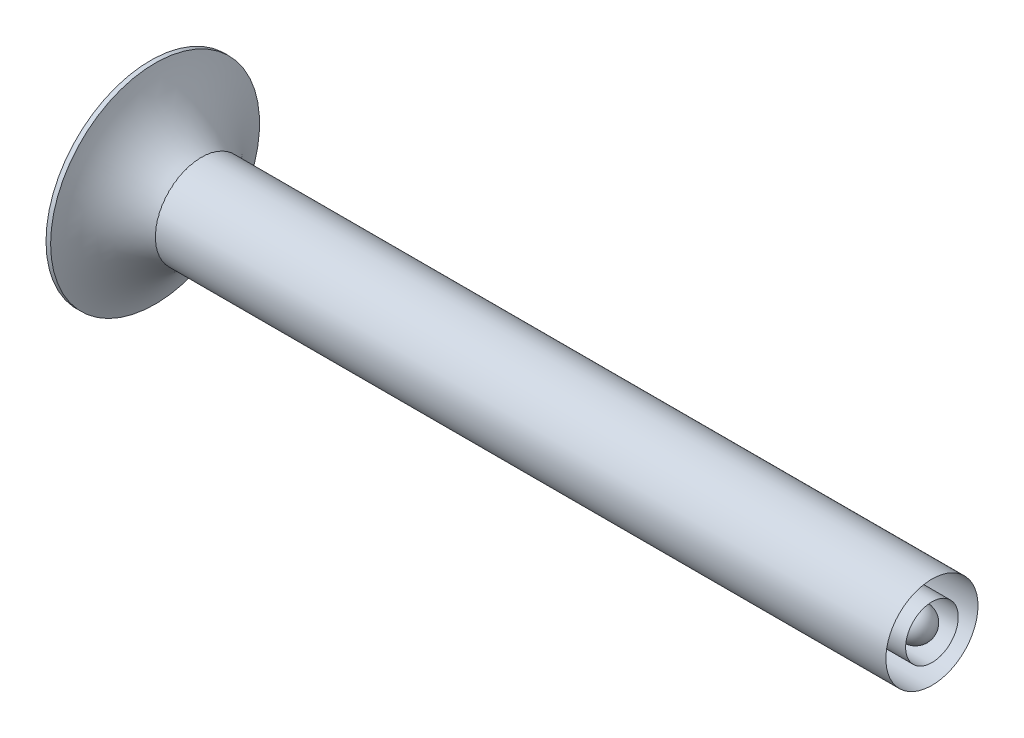
ISO-10303-21;
HEADER;
FILE_DESCRIPTION(('STEP AP214'),'2;1');
FILE_NAME('part.step','',(''),(''),'','','');
FILE_SCHEMA(('AUTOMOTIVE_DESIGN { 1 0 10303 214 1 1 1 1 }'));
ENDSEC;
DATA;
#1=APPLICATION_CONTEXT('core data for automotive mechanical design processes');
#2=APPLICATION_PROTOCOL_DEFINITION('international standard','automotive_design',2000,#1);
#3=PRODUCT_CONTEXT('',#1,'mechanical');
#4=PRODUCT('Part','Part','',(#3));
#5=PRODUCT_RELATED_PRODUCT_CATEGORY('part','',(#4));
#6=PRODUCT_DEFINITION_FORMATION('','',#4);
#7=PRODUCT_DEFINITION_CONTEXT('part definition',#1,'design');
#8=PRODUCT_DEFINITION('design','',#6,#7);
#9=PRODUCT_DEFINITION_SHAPE('','',#8);
#10=(LENGTH_UNIT() NAMED_UNIT(*) SI_UNIT(.MILLI.,.METRE.));
#11=(NAMED_UNIT(*) PLANE_ANGLE_UNIT() SI_UNIT($,.RADIAN.));
#12=(NAMED_UNIT(*) SI_UNIT($,.STERADIAN.) SOLID_ANGLE_UNIT());
#13=UNCERTAINTY_MEASURE_WITH_UNIT(LENGTH_MEASURE(1.E-05),#10,'distance_accuracy_value','');
#14=(GEOMETRIC_REPRESENTATION_CONTEXT(3) GLOBAL_UNCERTAINTY_ASSIGNED_CONTEXT((#13)) GLOBAL_UNIT_ASSIGNED_CONTEXT((#10,
#11,#12)) REPRESENTATION_CONTEXT('',''));
#15=CARTESIAN_POINT('',(0.,0.,0.));
#16=DIRECTION('',(0.,0.,1.));
#17=DIRECTION('',(1.,0.,0.));
#18=AXIS2_PLACEMENT_3D('',#15,#16,#17);
#19=CARTESIAN_POINT('',(0.,0.,0.));
#20=DIRECTION('',(1.,0.,0.));
#21=DIRECTION('',(0.,0.,-1.));
#22=AXIS2_PLACEMENT_3D('',#19,#20,#21);
#23=CYLINDRICAL_SURFACE('',#22,1.778);
#24=CARTESIAN_POINT('',(0.,0.,0.));
#25=DIRECTION('',(-1.,0.,0.));
#26=DIRECTION('',(0.,0.,1.));
#27=AXIS2_PLACEMENT_3D('',#24,#25,#26);
#28=CIRCLE('',#27,1.778);
#29=CARTESIAN_POINT('',(0.,0.,-1.778));
#30=VERTEX_POINT('',#29);
#31=EDGE_CURVE('E60',#30,#30,#28,.T.);
#32=CARTESIAN_POINT('',(30.1625,0.,0.));
#33=DIRECTION('',(-1.,0.,0.));
#34=DIRECTION('',(0.,0.,1.));
#35=AXIS2_PLACEMENT_3D('',#32,#33,#34);
#36=CIRCLE('',#35,1.778);
#37=CARTESIAN_POINT('',(30.1625,0.,-1.778));
#38=VERTEX_POINT('',#37);
#39=EDGE_CURVE('E11',#38,#38,#36,.T.);
#40=CARTESIAN_POINT('',(0.,0.,-1.778));
#41=CARTESIAN_POINT('',(0.314192708333333,0.,-1.778));
#42=CARTESIAN_POINT('',(0.628385416666667,0.,-1.778));
#43=CARTESIAN_POINT('',(1.25677083333333,0.,-1.778));
#44=CARTESIAN_POINT('',(1.57096354166667,0.,-1.778));
#45=CARTESIAN_POINT('',(2.19934895833333,0.,-1.778));
#46=CARTESIAN_POINT('',(2.51354166666667,0.,-1.778));
#47=CARTESIAN_POINT('',(3.14192708333333,0.,-1.778));
#48=CARTESIAN_POINT('',(3.45611979166667,0.,-1.778));
#49=CARTESIAN_POINT('',(4.08450520833333,0.,-1.778));
#50=CARTESIAN_POINT('',(4.39869791666667,0.,-1.778));
#51=CARTESIAN_POINT('',(5.02708333333333,0.,-1.778));
#52=CARTESIAN_POINT('',(5.34127604166667,0.,-1.778));
#53=CARTESIAN_POINT('',(5.96966145833333,0.,-1.778));
#54=CARTESIAN_POINT('',(6.28385416666667,0.,-1.778));
#55=CARTESIAN_POINT('',(6.91223958333333,0.,-1.778));
#56=CARTESIAN_POINT('',(7.22643229166667,0.,-1.778));
#57=CARTESIAN_POINT('',(7.85481770833333,0.,-1.778));
#58=CARTESIAN_POINT('',(8.16901041666667,0.,-1.778));
#59=CARTESIAN_POINT('',(8.79739583333333,0.,-1.778));
#60=CARTESIAN_POINT('',(9.11158854166666,0.,-1.778));
#61=CARTESIAN_POINT('',(9.73997395833333,0.,-1.778));
#62=CARTESIAN_POINT('',(10.0541666666667,0.,-1.778));
#63=CARTESIAN_POINT('',(10.6825520833333,0.,-1.778));
#64=CARTESIAN_POINT('',(10.9967447916667,0.,-1.778));
#65=CARTESIAN_POINT('',(11.6251302083333,0.,-1.778));
#66=CARTESIAN_POINT('',(11.9393229166667,0.,-1.778));
#67=CARTESIAN_POINT('',(12.5677083333333,0.,-1.778));
#68=CARTESIAN_POINT('',(12.8819010416667,0.,-1.778));
#69=CARTESIAN_POINT('',(13.5102864583333,0.,-1.778));
#70=CARTESIAN_POINT('',(13.8244791666667,0.,-1.778));
#71=CARTESIAN_POINT('',(14.4528645833333,0.,-1.778));
#72=CARTESIAN_POINT('',(14.7670572916667,0.,-1.778));
#73=CARTESIAN_POINT('',(15.3954427083333,0.,-1.778));
#74=CARTESIAN_POINT('',(15.7096354166667,0.,-1.778));
#75=CARTESIAN_POINT('',(16.3380208333333,0.,-1.778));
#76=CARTESIAN_POINT('',(16.6522135416667,0.,-1.778));
#77=CARTESIAN_POINT('',(17.2805989583333,0.,-1.778));
#78=CARTESIAN_POINT('',(17.5947916666667,0.,-1.778));
#79=CARTESIAN_POINT('',(18.2231770833333,0.,-1.778));
#80=CARTESIAN_POINT('',(18.5373697916667,0.,-1.778));
#81=CARTESIAN_POINT('',(19.1657552083333,0.,-1.778));
#82=CARTESIAN_POINT('',(19.4799479166667,0.,-1.778));
#83=CARTESIAN_POINT('',(20.1083333333333,0.,-1.778));
#84=CARTESIAN_POINT('',(20.4225260416667,0.,-1.778));
#85=CARTESIAN_POINT('',(21.0509114583333,0.,-1.778));
#86=CARTESIAN_POINT('',(21.3651041666667,0.,-1.778));
#87=CARTESIAN_POINT('',(21.9934895833333,0.,-1.778));
#88=CARTESIAN_POINT('',(22.3076822916667,0.,-1.778));
#89=CARTESIAN_POINT('',(22.9360677083333,0.,-1.778));
#90=CARTESIAN_POINT('',(23.2502604166667,0.,-1.778));
#91=CARTESIAN_POINT('',(23.8786458333333,0.,-1.778));
#92=CARTESIAN_POINT('',(24.1928385416667,0.,-1.778));
#93=CARTESIAN_POINT('',(24.8212239583333,0.,-1.778));
#94=CARTESIAN_POINT('',(25.1354166666667,0.,-1.778));
#95=CARTESIAN_POINT('',(25.7638020833333,0.,-1.778));
#96=CARTESIAN_POINT('',(26.0779947916667,0.,-1.778));
#97=CARTESIAN_POINT('',(26.7063802083333,0.,-1.778));
#98=CARTESIAN_POINT('',(27.0205729166667,0.,-1.778));
#99=CARTESIAN_POINT('',(27.6489583333333,0.,-1.778));
#100=CARTESIAN_POINT('',(27.9631510416667,0.,-1.778));
#101=CARTESIAN_POINT('',(28.5915364583333,0.,-1.778));
#102=CARTESIAN_POINT('',(28.9057291666667,0.,-1.778));
#103=CARTESIAN_POINT('',(29.5341145833333,0.,-1.778));
#104=CARTESIAN_POINT('',(29.8483072916667,0.,-1.778));
#105=CARTESIAN_POINT('',(30.1625,0.,-1.778));
#106=B_SPLINE_CURVE_WITH_KNOTS('',3,(#40,#41,#42,#43,#44,#45,#46,#47,#48,#49,#50,#51,#52,#53,
#54,#55,#56,#57,#58,#59,#60,#61,#62,#63,#64,#65,#66,#67,#68,#69,#70,#71,#72,#73,#74,#75,#76,#77,
#78,#79,#80,#81,#82,#83,#84,#85,#86,#87,#88,#89,#90,#91,#92,#93,#94,#95,#96,#97,#98,#99,#100,
#101,#102,#103,#104,#105),.UNSPECIFIED.,.F.,.F.,(4,2,2,2,2,2,2,2,2,2,2,2,2,2,2,2,2,2,2,2,2,2,2,
2,2,2,2,2,2,2,2,2,4),(0.,0.942578125,1.88515625,2.827734375,3.7703125,4.712890625,5.65546875,
6.598046875,7.540625,8.483203125,9.42578125,10.368359375,11.3109375,12.253515625,13.19609375,
14.138671875,15.08125,16.023828125,16.96640625,17.908984375,18.8515625,19.794140625,20.73671875,
21.679296875,22.621875,23.564453125,24.50703125,25.449609375,26.3921875,27.334765625,
28.27734375,29.219921875,30.1625),.UNSPECIFIED.);
#107=EDGE_CURVE('BSEAM56',#30,#38,#106,.T.);
#108=ORIENTED_EDGE('',*,*,#31,.T.);
#109=ORIENTED_EDGE('',*,*,#39,.F.);
#110=ORIENTED_EDGE('',*,*,#107,.T.);
#111=ORIENTED_EDGE('',*,*,#107,.F.);
#112=EDGE_LOOP('',(#108,#110,#109,#111));
#113=FACE_BOUND('',#112,.T.);
#114=ADVANCED_FACE('F56',(#113),#23,.F.);
#115=OPEN_SHELL('',(#114));
#116=SHELL_BASED_SURFACE_MODEL('B2',(#115));
#117=CARTESIAN_POINT('',(0.,0.,0.));
#118=DIRECTION('',(1.,0.,0.));
#119=DIRECTION('',(0.,0.,-1.));
#120=AXIS2_PLACEMENT_3D('',#117,#118,#119);
#121=CYLINDRICAL_SURFACE('',#120,1.016);
#122=CARTESIAN_POINT('',(0.,0.,0.));
#123=DIRECTION('',(1.,0.,0.));
#124=DIRECTION('',(0.,0.,-1.));
#125=AXIS2_PLACEMENT_3D('',#122,#123,#124);
#126=CIRCLE('',#125,1.016);
#127=CARTESIAN_POINT('',(0.,0.,-1.016));
#128=VERTEX_POINT('',#127);
#129=EDGE_CURVE('E94',#128,#128,#126,.T.);
#130=CARTESIAN_POINT('',(30.1625,0.,0.));
#131=DIRECTION('',(1.,0.,0.));
#132=DIRECTION('',(0.,0.,-1.));
#133=AXIS2_PLACEMENT_3D('',#130,#131,#132);
#134=CIRCLE('',#133,1.016);
#135=CARTESIAN_POINT('',(30.1625,0.,-1.016));
#136=VERTEX_POINT('',#135);
#137=EDGE_CURVE('E55',#136,#136,#134,.T.);
#138=CARTESIAN_POINT('',(0.,0.,-1.016));
#139=CARTESIAN_POINT('',(0.314192708333333,0.,-1.016));
#140=CARTESIAN_POINT('',(0.628385416666667,0.,-1.016));
#141=CARTESIAN_POINT('',(1.25677083333333,0.,-1.016));
#142=CARTESIAN_POINT('',(1.57096354166667,0.,-1.016));
#143=CARTESIAN_POINT('',(2.19934895833333,0.,-1.016));
#144=CARTESIAN_POINT('',(2.51354166666667,0.,-1.016));
#145=CARTESIAN_POINT('',(3.14192708333333,0.,-1.016));
#146=CARTESIAN_POINT('',(3.45611979166667,0.,-1.016));
#147=CARTESIAN_POINT('',(4.08450520833333,0.,-1.016));
#148=CARTESIAN_POINT('',(4.39869791666667,0.,-1.016));
#149=CARTESIAN_POINT('',(5.02708333333333,0.,-1.016));
#150=CARTESIAN_POINT('',(5.34127604166667,0.,-1.016));
#151=CARTESIAN_POINT('',(5.96966145833333,0.,-1.016));
#152=CARTESIAN_POINT('',(6.28385416666667,0.,-1.016));
#153=CARTESIAN_POINT('',(6.91223958333333,0.,-1.016));
#154=CARTESIAN_POINT('',(7.22643229166667,0.,-1.016));
#155=CARTESIAN_POINT('',(7.85481770833333,0.,-1.016));
#156=CARTESIAN_POINT('',(8.16901041666667,0.,-1.016));
#157=CARTESIAN_POINT('',(8.79739583333333,0.,-1.016));
#158=CARTESIAN_POINT('',(9.11158854166666,0.,-1.016));
#159=CARTESIAN_POINT('',(9.73997395833333,0.,-1.016));
#160=CARTESIAN_POINT('',(10.0541666666667,0.,-1.016));
#161=CARTESIAN_POINT('',(10.6825520833333,0.,-1.016));
#162=CARTESIAN_POINT('',(10.9967447916667,0.,-1.016));
#163=CARTESIAN_POINT('',(11.6251302083333,0.,-1.016));
#164=CARTESIAN_POINT('',(11.9393229166667,0.,-1.016));
#165=CARTESIAN_POINT('',(12.5677083333333,0.,-1.016));
#166=CARTESIAN_POINT('',(12.8819010416667,0.,-1.016));
#167=CARTESIAN_POINT('',(13.5102864583333,0.,-1.016));
#168=CARTESIAN_POINT('',(13.8244791666667,0.,-1.016));
#169=CARTESIAN_POINT('',(14.4528645833333,0.,-1.016));
#170=CARTESIAN_POINT('',(14.7670572916667,0.,-1.016));
#171=CARTESIAN_POINT('',(15.3954427083333,0.,-1.016));
#172=CARTESIAN_POINT('',(15.7096354166667,0.,-1.016));
#173=CARTESIAN_POINT('',(16.3380208333333,0.,-1.016));
#174=CARTESIAN_POINT('',(16.6522135416667,0.,-1.016));
#175=CARTESIAN_POINT('',(17.2805989583333,0.,-1.016));
#176=CARTESIAN_POINT('',(17.5947916666667,0.,-1.016));
#177=CARTESIAN_POINT('',(18.2231770833333,0.,-1.016));
#178=CARTESIAN_POINT('',(18.5373697916667,0.,-1.016));
#179=CARTESIAN_POINT('',(19.1657552083333,0.,-1.016));
#180=CARTESIAN_POINT('',(19.4799479166667,0.,-1.016));
#181=CARTESIAN_POINT('',(20.1083333333333,0.,-1.016));
#182=CARTESIAN_POINT('',(20.4225260416667,0.,-1.016));
#183=CARTESIAN_POINT('',(21.0509114583333,0.,-1.016));
#184=CARTESIAN_POINT('',(21.3651041666667,0.,-1.016));
#185=CARTESIAN_POINT('',(21.9934895833333,0.,-1.016));
#186=CARTESIAN_POINT('',(22.3076822916667,0.,-1.016));
#187=CARTESIAN_POINT('',(22.9360677083333,0.,-1.016));
#188=CARTESIAN_POINT('',(23.2502604166667,0.,-1.016));
#189=CARTESIAN_POINT('',(23.8786458333333,0.,-1.016));
#190=CARTESIAN_POINT('',(24.1928385416667,0.,-1.016));
#191=CARTESIAN_POINT('',(24.8212239583333,0.,-1.016));
#192=CARTESIAN_POINT('',(25.1354166666667,0.,-1.016));
#193=CARTESIAN_POINT('',(25.7638020833333,0.,-1.016));
#194=CARTESIAN_POINT('',(26.0779947916667,0.,-1.016));
#195=CARTESIAN_POINT('',(26.7063802083333,0.,-1.016));
#196=CARTESIAN_POINT('',(27.0205729166667,0.,-1.016));
#197=CARTESIAN_POINT('',(27.6489583333333,0.,-1.016));
#198=CARTESIAN_POINT('',(27.9631510416667,0.,-1.016));
#199=CARTESIAN_POINT('',(28.5915364583333,0.,-1.016));
#200=CARTESIAN_POINT('',(28.9057291666667,0.,-1.016));
#201=CARTESIAN_POINT('',(29.5341145833333,0.,-1.016));
#202=CARTESIAN_POINT('',(29.8483072916667,0.,-1.016));
#203=CARTESIAN_POINT('',(30.1625,0.,-1.016));
#204=B_SPLINE_CURVE_WITH_KNOTS('',3,(#138,#139,#140,#141,#142,#143,#144,#145,#146,#147,#148,
#149,#150,#151,#152,#153,#154,#155,#156,#157,#158,#159,#160,#161,#162,#163,#164,#165,#166,#167,
#168,#169,#170,#171,#172,#173,#174,#175,#176,#177,#178,#179,#180,#181,#182,#183,#184,#185,#186,
#187,#188,#189,#190,#191,#192,#193,#194,#195,#196,#197,#198,#199,#200,#201,#202,#203),
.UNSPECIFIED.,.F.,.F.,(4,2,2,2,2,2,2,2,2,2,2,2,2,2,2,2,2,2,2,2,2,2,2,2,2,2,2,2,2,2,2,2,4),(0.,
0.942578125,1.88515625,2.827734375,3.7703125,4.712890625,5.65546875,6.598046875,7.540625,
8.483203125,9.42578125,10.368359375,11.3109375,12.253515625,13.19609375,14.138671875,15.08125,
16.023828125,16.96640625,17.908984375,18.8515625,19.794140625,20.73671875,21.679296875,
22.621875,23.564453125,24.50703125,25.449609375,26.3921875,27.334765625,28.27734375,
29.219921875,30.1625),.UNSPECIFIED.);
#205=EDGE_CURVE('BSEAM90',#128,#136,#204,.T.);
#206=ORIENTED_EDGE('',*,*,#129,.T.);
#207=ORIENTED_EDGE('',*,*,#137,.F.);
#208=ORIENTED_EDGE('',*,*,#205,.T.);
#209=ORIENTED_EDGE('',*,*,#205,.F.);
#210=EDGE_LOOP('',(#206,#208,#207,#209));
#211=FACE_BOUND('',#210,.T.);
#212=ADVANCED_FACE('F90',(#211),#121,.T.);
#213=OPEN_SHELL('',(#212));
#214=SHELL_BASED_SURFACE_MODEL('B6',(#213));
#215=CARTESIAN_POINT('',(0.,0.,0.));
#216=DIRECTION('',(-1.,0.,0.));
#217=DIRECTION('',(0.,0.,1.));
#218=AXIS2_PLACEMENT_3D('',#215,#216,#217);
#219=CYLINDRICAL_SURFACE('',#218,4.03225);
#220=CARTESIAN_POINT('',(0.177800000000001,0.,0.));
#221=DIRECTION('',(-1.,0.,0.));
#222=DIRECTION('',(0.,0.,1.));
#223=AXIS2_PLACEMENT_3D('',#220,#221,#222);
#224=CIRCLE('',#223,4.03225);
#225=CARTESIAN_POINT('',(0.177800000000001,0.,4.03225));
#226=VERTEX_POINT('',#225);
#227=EDGE_CURVE('E142',#226,#226,#224,.T.);
#228=ORIENTED_EDGE('',*,*,#227,.T.);
#229=EDGE_LOOP('',(#228));
#230=FACE_BOUND('',#229,.T.);
#231=CARTESIAN_POINT('',(0.,0.,0.));
#232=DIRECTION('',(-1.,0.,0.));
#233=DIRECTION('',(0.,0.,1.));
#234=AXIS2_PLACEMENT_3D('',#231,#232,#233);
#235=CIRCLE('',#234,4.03225);
#236=CARTESIAN_POINT('',(0.,0.,4.03225));
#237=VERTEX_POINT('',#236);
#238=EDGE_CURVE('E89',#237,#237,#235,.T.);
#239=ORIENTED_EDGE('',*,*,#238,.F.);
#240=EDGE_LOOP('',(#239));
#241=FACE_BOUND('',#240,.T.);
#242=ADVANCED_FACE('F117',(#230,#241),#219,.T.);
#243=CARTESIAN_POINT('',(0.,-4.03225,0.));
#244=DIRECTION('',(-1.,0.,0.));
#245=DIRECTION('',(0.,0.,1.));
#246=AXIS2_PLACEMENT_3D('',#243,#244,#245);
#247=PLANE('',#246);
#248=ORIENTED_EDGE('',*,*,#238,.T.);
#249=EDGE_LOOP('',(#248));
#250=FACE_BOUND('',#249,.T.);
#251=ADVANCED_FACE('F160',(#250),#247,.T.);
#252=CARTESIAN_POINT('',(29.5275,0.,0.));
#253=DIRECTION('',(-1.,0.,0.));
#254=DIRECTION('',(0.,-1.,0.));
#255=AXIS2_PLACEMENT_3D('',#252,#253,#254);
#256=SPHERICAL_SURFACE('',#255,0.635);
#257=CARTESIAN_POINT('',(29.6103841320597,0.,0.));
#258=DIRECTION('',(-1.,0.,0.));
#259=DIRECTION('',(0.,0.,1.));
#260=AXIS2_PLACEMENT_3D('',#257,#258,#259);
#261=CIRCLE('',#260,0.62956748697237);
#262=CARTESIAN_POINT('',(29.6103841320597,0.,0.62956748697237));
#263=VERTEX_POINT('',#262);
#264=EDGE_CURVE('E123',#263,#263,#261,.T.);
#265=ORIENTED_EDGE('',*,*,#264,.F.);
#266=EDGE_LOOP('',(#265));
#267=FACE_BOUND('',#266,.T.);
#268=ADVANCED_FACE('F164',(#267),#256,.T.);
#269=CARTESIAN_POINT('',(26.6751377819393,0.,0.));
#270=DIRECTION('',(-1.,0.,0.));
#271=DIRECTION('',(0.,0.,1.));
#272=AXIS2_PLACEMENT_3D('',#269,#270,#271);
#273=CONICAL_SURFACE('',#272,1.016,0.130899693899571);
#274=ORIENTED_EDGE('',*,*,#264,.T.);
#275=EDGE_LOOP('',(#274));
#276=FACE_BOUND('',#275,.T.);
#277=CARTESIAN_POINT('',(26.6751377819393,0.,0.));
#278=DIRECTION('',(-1.,0.,0.));
#279=DIRECTION('',(0.,0.,1.));
#280=AXIS2_PLACEMENT_3D('',#277,#278,#279);
#281=CIRCLE('',#280,1.016);
#282=CARTESIAN_POINT('',(26.6751377819393,0.,1.016));
#283=VERTEX_POINT('',#282);
#284=EDGE_CURVE('E127',#283,#283,#281,.T.);
#285=ORIENTED_EDGE('',*,*,#284,.F.);
#286=EDGE_LOOP('',(#285));
#287=FACE_BOUND('',#286,.T.);
#288=ADVANCED_FACE('F168',(#276,#287),#273,.T.);
#289=CARTESIAN_POINT('',(0.,0.,0.));
#290=DIRECTION('',(-1.,0.,0.));
#291=DIRECTION('',(0.,0.,1.));
#292=AXIS2_PLACEMENT_3D('',#289,#290,#291);
#293=CYLINDRICAL_SURFACE('',#292,1.016);
#294=ORIENTED_EDGE('',*,*,#284,.T.);
#295=EDGE_LOOP('',(#294));
#296=FACE_BOUND('',#295,.T.);
#297=CARTESIAN_POINT('',(7.19982154463217,0.,0.));
#298=DIRECTION('',(-1.,0.,0.));
#299=DIRECTION('',(0.,0.,1.));
#300=AXIS2_PLACEMENT_3D('',#297,#298,#299);
#301=CIRCLE('',#300,1.016);
#302=CARTESIAN_POINT('',(7.19982154463217,0.,1.016));
#303=VERTEX_POINT('',#302);
#304=EDGE_CURVE('E131',#303,#303,#301,.T.);
#305=ORIENTED_EDGE('',*,*,#304,.F.);
#306=EDGE_LOOP('',(#305));
#307=FACE_BOUND('',#306,.T.);
#308=ADVANCED_FACE('F174',(#296,#307),#293,.T.);
#309=CARTESIAN_POINT('',(5.2705,0.,0.));
#310=DIRECTION('',(-1.,0.,0.));
#311=DIRECTION('',(0.,0.,1.));
#312=AXIS2_PLACEMENT_3D('',#309,#310,#311);
#313=CONICAL_SURFACE('',#312,1.27,0.130899693899576);
#314=ORIENTED_EDGE('',*,*,#304,.T.);
#315=EDGE_LOOP('',(#314));
#316=FACE_BOUND('',#315,.T.);
#317=CARTESIAN_POINT('',(5.2705,0.,0.));
#318=DIRECTION('',(-1.,0.,0.));
#319=DIRECTION('',(0.,0.,1.));
#320=AXIS2_PLACEMENT_3D('',#317,#318,#319);
#321=CIRCLE('',#320,1.27);
#322=CARTESIAN_POINT('',(5.2705,0.,1.27));
#323=VERTEX_POINT('',#322);
#324=EDGE_CURVE('E136',#323,#323,#321,.T.);
#325=ORIENTED_EDGE('',*,*,#324,.F.);
#326=EDGE_LOOP('',(#325));
#327=FACE_BOUND('',#326,.T.);
#328=ADVANCED_FACE('F156',(#316,#327),#313,.T.);
#329=CARTESIAN_POINT('',(0.,0.,0.));
#330=DIRECTION('',(-1.,0.,0.));
#331=DIRECTION('',(0.,0.,1.));
#332=AXIS2_PLACEMENT_3D('',#329,#330,#331);
#333=CYLINDRICAL_SURFACE('',#332,1.27);
#334=ORIENTED_EDGE('',*,*,#324,.T.);
#335=EDGE_LOOP('',(#334));
#336=FACE_BOUND('',#335,.T.);
#337=CARTESIAN_POINT('',(3.8608,0.,0.));
#338=DIRECTION('',(-1.,0.,0.));
#339=DIRECTION('',(0.,0.,1.));
#340=AXIS2_PLACEMENT_3D('',#337,#338,#339);
#341=CIRCLE('',#340,1.27);
#342=CARTESIAN_POINT('',(3.8608,0.,1.27));
#343=VERTEX_POINT('',#342);
#344=EDGE_CURVE('E139',#343,#343,#341,.T.);
#345=ORIENTED_EDGE('',*,*,#344,.F.);
#346=EDGE_LOOP('',(#345));
#347=FACE_BOUND('',#346,.T.);
#348=ADVANCED_FACE('F150',(#336,#347),#333,.T.);
#349=CARTESIAN_POINT('',(3.8608,0.,0.));
#350=DIRECTION('',(-1.,0.,0.));
#351=DIRECTION('',(0.,0.,1.));
#352=AXIS2_PLACEMENT_3D('',#349,#350,#351);
#353=TOROIDAL_SURFACE('',#352,5.10645833333333,3.83645833333333);
#354=ORIENTED_EDGE('',*,*,#344,.T.);
#355=EDGE_LOOP('',(#354));
#356=FACE_BOUND('',#355,.T.);
#357=ORIENTED_EDGE('',*,*,#227,.F.);
#358=EDGE_LOOP('',(#357));
#359=FACE_BOUND('',#358,.T.);
#360=ADVANCED_FACE('F148',(#356,#359),#353,.F.);
#361=CLOSED_SHELL('',(#242,#251,#268,#288,#308,#328,#348,#360));
#362=MANIFOLD_SOLID_BREP('B50',#361);
#363=ADVANCED_BREP_SHAPE_REPRESENTATION('',(#18,#362),#14);
#364=MANIFOLD_SURFACE_SHAPE_REPRESENTATION('',(#18,#116,#214),#14);
#365=SHAPE_REPRESENTATION('',(#18),#14);
#366=SHAPE_DEFINITION_REPRESENTATION(#9,#365);
#367=SHAPE_REPRESENTATION_RELATIONSHIP('','',#365,#363);
#368=SHAPE_REPRESENTATION_RELATIONSHIP('','',#365,#364);
ENDSEC;
END-ISO-10303-21;
